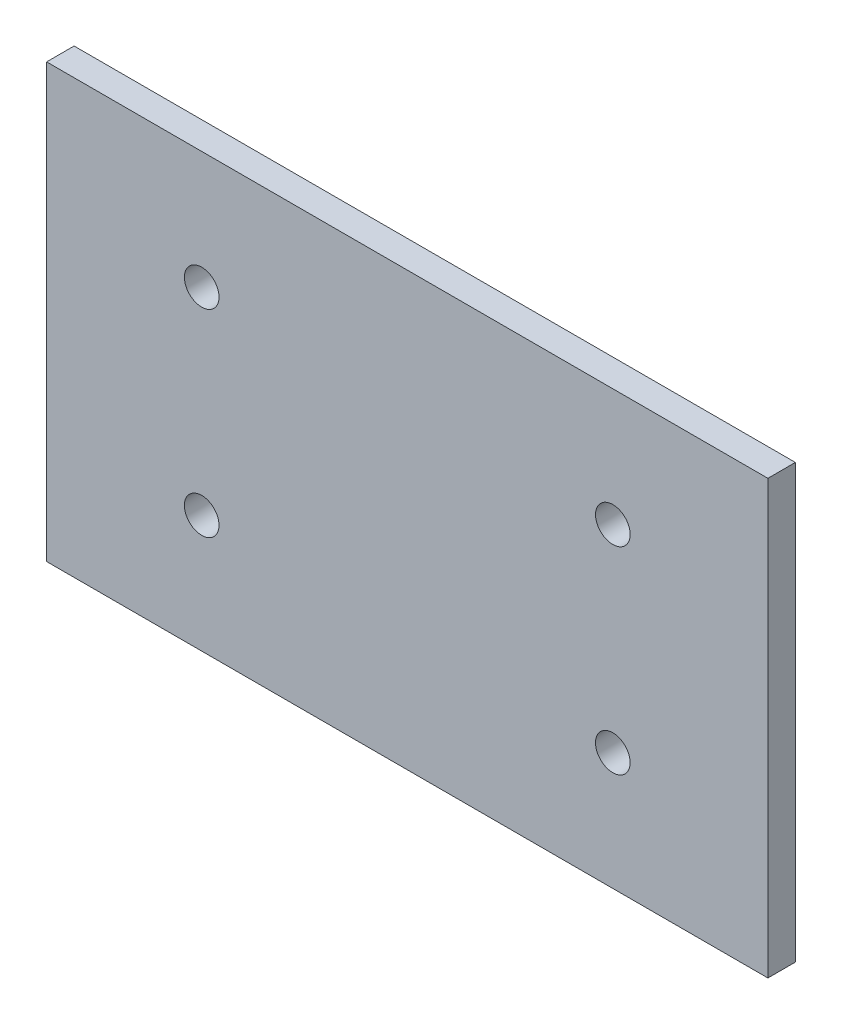
ISO-10303-21;
HEADER;
FILE_DESCRIPTION(('STEP AP214'),'2;1');
FILE_NAME('part.step','',(''),(''),'','','');
FILE_SCHEMA(('AUTOMOTIVE_DESIGN { 1 0 10303 214 1 1 1 1 }'));
ENDSEC;
DATA;
#1=APPLICATION_CONTEXT('core data for automotive mechanical design processes');
#2=APPLICATION_PROTOCOL_DEFINITION('international standard','automotive_design',2000,#1);
#3=PRODUCT_CONTEXT('',#1,'mechanical');
#4=PRODUCT('Part','Part','',(#3));
#5=PRODUCT_RELATED_PRODUCT_CATEGORY('part','',(#4));
#6=PRODUCT_DEFINITION_FORMATION('','',#4);
#7=PRODUCT_DEFINITION_CONTEXT('part definition',#1,'design');
#8=PRODUCT_DEFINITION('design','',#6,#7);
#9=PRODUCT_DEFINITION_SHAPE('','',#8);
#10=(LENGTH_UNIT() NAMED_UNIT(*) SI_UNIT(.MILLI.,.METRE.));
#11=(NAMED_UNIT(*) PLANE_ANGLE_UNIT() SI_UNIT($,.RADIAN.));
#12=(NAMED_UNIT(*) SI_UNIT($,.STERADIAN.) SOLID_ANGLE_UNIT());
#13=UNCERTAINTY_MEASURE_WITH_UNIT(LENGTH_MEASURE(1.E-05),#10,'distance_accuracy_value','');
#14=(GEOMETRIC_REPRESENTATION_CONTEXT(3) GLOBAL_UNCERTAINTY_ASSIGNED_CONTEXT((#13)) GLOBAL_UNIT_ASSIGNED_CONTEXT((#10,
#11,#12)) REPRESENTATION_CONTEXT('',''));
#15=CARTESIAN_POINT('',(0.,0.,0.));
#16=DIRECTION('',(0.,0.,1.));
#17=DIRECTION('',(1.,0.,0.));
#18=AXIS2_PLACEMENT_3D('',#15,#16,#17);
#19=CARTESIAN_POINT('',(0.,0.,9.525));
#20=DIRECTION('',(0.,0.,1.));
#21=DIRECTION('',(1.,0.,0.));
#22=AXIS2_PLACEMENT_3D('',#19,#20,#21);
#23=PLANE('',#22);
#24=CARTESIAN_POINT('',(196.25,-109.25,9.525));
#25=DIRECTION('',(0.,0.,1.));
#26=DIRECTION('',(1.,0.,0.));
#27=AXIS2_PLACEMENT_3D('',#24,#25,#26);
#28=CIRCLE('',#27,6.00000000000002);
#29=CARTESIAN_POINT('',(190.25,-109.25,9.525));
#30=VERTEX_POINT('',#29);
#31=EDGE_CURVE('E121',#30,#30,#28,.T.);
#32=ORIENTED_EDGE('',*,*,#31,.F.);
#33=EDGE_LOOP('',(#32));
#34=FACE_BOUND('',#33,.T.);
#35=CARTESIAN_POINT('',(53.75,-40.75,9.525));
#36=DIRECTION('',(0.,0.,1.));
#37=DIRECTION('',(1.,0.,0.));
#38=AXIS2_PLACEMENT_3D('',#35,#36,#37);
#39=CIRCLE('',#38,6.00000000000001);
#40=CARTESIAN_POINT('',(47.75,-40.75,9.525));
#41=VERTEX_POINT('',#40);
#42=EDGE_CURVE('E100',#41,#41,#39,.T.);
#43=ORIENTED_EDGE('',*,*,#42,.F.);
#44=EDGE_LOOP('',(#43));
#45=FACE_BOUND('',#44,.T.);
#46=DIRECTION('',(0.,-1.,0.));
#47=VECTOR('',#46,1.);
#48=CARTESIAN_POINT('',(0.,0.,9.525));
#49=LINE('',#48,#47);
#50=CARTESIAN_POINT('',(0.,0.,9.525));
#51=VERTEX_POINT('',#50);
#52=CARTESIAN_POINT('',(0.,-150.,9.525));
#53=VERTEX_POINT('',#52);
#54=EDGE_CURVE('E85',#51,#53,#49,.T.);
#55=ORIENTED_EDGE('',*,*,#54,.T.);
#56=DIRECTION('',(1.,0.,0.));
#57=VECTOR('',#56,1.);
#58=CARTESIAN_POINT('',(0.,-150.,9.525));
#59=LINE('',#58,#57);
#60=CARTESIAN_POINT('',(250.,-150.,9.525));
#61=VERTEX_POINT('',#60);
#62=EDGE_CURVE('E80',#53,#61,#59,.T.);
#63=ORIENTED_EDGE('',*,*,#62,.T.);
#64=DIRECTION('',(0.,1.,0.));
#65=VECTOR('',#64,1.);
#66=CARTESIAN_POINT('',(250.,0.,9.525));
#67=LINE('',#66,#65);
#68=CARTESIAN_POINT('',(250.,0.,9.525));
#69=VERTEX_POINT('',#68);
#70=EDGE_CURVE('E83',#61,#69,#67,.T.);
#71=ORIENTED_EDGE('',*,*,#70,.T.);
#72=DIRECTION('',(-1.,0.,0.));
#73=VECTOR('',#72,1.);
#74=CARTESIAN_POINT('',(0.,0.,9.525));
#75=LINE('',#74,#73);
#76=EDGE_CURVE('E50',#69,#51,#75,.T.);
#77=ORIENTED_EDGE('',*,*,#76,.T.);
#78=EDGE_LOOP('',(#55,#63,#71,#77));
#79=FACE_BOUND('',#78,.T.);
#80=CARTESIAN_POINT('',(196.25,-40.75,9.525));
#81=DIRECTION('',(0.,0.,1.));
#82=DIRECTION('',(1.,0.,0.));
#83=AXIS2_PLACEMENT_3D('',#80,#81,#82);
#84=CIRCLE('',#83,6.00000000000002);
#85=CARTESIAN_POINT('',(190.25,-40.75,9.525));
#86=VERTEX_POINT('',#85);
#87=EDGE_CURVE('E115',#86,#86,#84,.T.);
#88=ORIENTED_EDGE('',*,*,#87,.F.);
#89=EDGE_LOOP('',(#88));
#90=FACE_BOUND('',#89,.T.);
#91=CARTESIAN_POINT('',(53.75,-109.25,9.525));
#92=DIRECTION('',(0.,0.,1.));
#93=DIRECTION('',(1.,0.,0.));
#94=AXIS2_PLACEMENT_3D('',#91,#92,#93);
#95=CIRCLE('',#94,6.00000000000001);
#96=CARTESIAN_POINT('',(47.75,-109.25,9.525));
#97=VERTEX_POINT('',#96);
#98=EDGE_CURVE('E127',#97,#97,#95,.T.);
#99=ORIENTED_EDGE('',*,*,#98,.F.);
#100=EDGE_LOOP('',(#99));
#101=FACE_BOUND('',#100,.T.);
#102=ADVANCED_FACE('F33',(#34,#45,#79,#90,#101),#23,.T.);
#103=CARTESIAN_POINT('',(0.,0.,0.));
#104=DIRECTION('',(0.,0.,1.));
#105=DIRECTION('',(1.,0.,0.));
#106=AXIS2_PLACEMENT_3D('',#103,#104,#105);
#107=PLANE('',#106);
#108=DIRECTION('',(0.,-1.,0.));
#109=VECTOR('',#108,1.);
#110=CARTESIAN_POINT('',(0.,0.,0.));
#111=LINE('',#110,#109);
#112=CARTESIAN_POINT('',(0.,0.,0.));
#113=VERTEX_POINT('',#112);
#114=CARTESIAN_POINT('',(0.,-150.,0.));
#115=VERTEX_POINT('',#114);
#116=EDGE_CURVE('E97',#113,#115,#111,.T.);
#117=ORIENTED_EDGE('',*,*,#116,.F.);
#118=DIRECTION('',(-1.,0.,0.));
#119=VECTOR('',#118,1.);
#120=CARTESIAN_POINT('',(0.,0.,0.));
#121=LINE('',#120,#119);
#122=CARTESIAN_POINT('',(250.,0.,0.));
#123=VERTEX_POINT('',#122);
#124=EDGE_CURVE('E73',#123,#113,#121,.T.);
#125=ORIENTED_EDGE('',*,*,#124,.F.);
#126=DIRECTION('',(0.,1.,0.));
#127=VECTOR('',#126,1.);
#128=CARTESIAN_POINT('',(250.,0.,0.));
#129=LINE('',#128,#127);
#130=CARTESIAN_POINT('',(250.,-150.,0.));
#131=VERTEX_POINT('',#130);
#132=EDGE_CURVE('E67',#131,#123,#129,.T.);
#133=ORIENTED_EDGE('',*,*,#132,.F.);
#134=DIRECTION('',(1.,0.,0.));
#135=VECTOR('',#134,1.);
#136=CARTESIAN_POINT('',(0.,-150.,0.));
#137=LINE('',#136,#135);
#138=EDGE_CURVE('E89',#115,#131,#137,.T.);
#139=ORIENTED_EDGE('',*,*,#138,.F.);
#140=EDGE_LOOP('',(#117,#125,#133,#139));
#141=FACE_BOUND('',#140,.T.);
#142=CARTESIAN_POINT('',(53.75,-40.75,0.));
#143=DIRECTION('',(0.,0.,1.));
#144=DIRECTION('',(1.,0.,0.));
#145=AXIS2_PLACEMENT_3D('',#142,#143,#144);
#146=CIRCLE('',#145,6.00000000000001);
#147=CARTESIAN_POINT('',(47.75,-40.75,0.));
#148=VERTEX_POINT('',#147);
#149=EDGE_CURVE('E112',#148,#148,#146,.T.);
#150=ORIENTED_EDGE('',*,*,#149,.T.);
#151=EDGE_LOOP('',(#150));
#152=FACE_BOUND('',#151,.T.);
#153=CARTESIAN_POINT('',(196.25,-40.75,0.));
#154=DIRECTION('',(0.,0.,1.));
#155=DIRECTION('',(1.,0.,0.));
#156=AXIS2_PLACEMENT_3D('',#153,#154,#155);
#157=CIRCLE('',#156,6.00000000000002);
#158=CARTESIAN_POINT('',(190.25,-40.75,0.));
#159=VERTEX_POINT('',#158);
#160=EDGE_CURVE('E118',#159,#159,#157,.T.);
#161=ORIENTED_EDGE('',*,*,#160,.T.);
#162=EDGE_LOOP('',(#161));
#163=FACE_BOUND('',#162,.T.);
#164=CARTESIAN_POINT('',(196.25,-109.25,0.));
#165=DIRECTION('',(0.,0.,1.));
#166=DIRECTION('',(1.,0.,0.));
#167=AXIS2_PLACEMENT_3D('',#164,#165,#166);
#168=CIRCLE('',#167,6.00000000000002);
#169=CARTESIAN_POINT('',(190.25,-109.25,0.));
#170=VERTEX_POINT('',#169);
#171=EDGE_CURVE('E124',#170,#170,#168,.T.);
#172=ORIENTED_EDGE('',*,*,#171,.T.);
#173=EDGE_LOOP('',(#172));
#174=FACE_BOUND('',#173,.T.);
#175=CARTESIAN_POINT('',(53.75,-109.25,0.));
#176=DIRECTION('',(0.,0.,1.));
#177=DIRECTION('',(1.,0.,0.));
#178=AXIS2_PLACEMENT_3D('',#175,#176,#177);
#179=CIRCLE('',#178,6.00000000000001);
#180=CARTESIAN_POINT('',(47.75,-109.25,0.));
#181=VERTEX_POINT('',#180);
#182=EDGE_CURVE('E130',#181,#181,#179,.T.);
#183=ORIENTED_EDGE('',*,*,#182,.T.);
#184=EDGE_LOOP('',(#183));
#185=FACE_BOUND('',#184,.T.);
#186=ADVANCED_FACE('F108',(#141,#152,#163,#174,#185),#107,.F.);
#187=CARTESIAN_POINT('',(0.,0.,9.525));
#188=DIRECTION('',(1.,0.,0.));
#189=DIRECTION('',(0.,1.,0.));
#190=AXIS2_PLACEMENT_3D('',#187,#188,#189);
#191=PLANE('',#190);
#192=ORIENTED_EDGE('',*,*,#116,.T.);
#193=DIRECTION('',(0.,0.,-1.));
#194=VECTOR('',#193,1.);
#195=CARTESIAN_POINT('',(0.,-150.,9.525));
#196=LINE('',#195,#194);
#197=EDGE_CURVE('E11',#53,#115,#196,.T.);
#198=ORIENTED_EDGE('',*,*,#197,.F.);
#199=ORIENTED_EDGE('',*,*,#54,.F.);
#200=DIRECTION('',(0.,0.,-1.));
#201=VECTOR('',#200,1.);
#202=CARTESIAN_POINT('',(0.,0.,9.525));
#203=LINE('',#202,#201);
#204=EDGE_CURVE('E93',#51,#113,#203,.T.);
#205=ORIENTED_EDGE('',*,*,#204,.T.);
#206=EDGE_LOOP('',(#192,#198,#199,#205));
#207=FACE_BOUND('',#206,.T.);
#208=ADVANCED_FACE('F35',(#207),#191,.F.);
#209=CARTESIAN_POINT('',(0.,-150.,9.525));
#210=DIRECTION('',(0.,1.,0.));
#211=DIRECTION('',(0.,0.,1.));
#212=AXIS2_PLACEMENT_3D('',#209,#210,#211);
#213=PLANE('',#212);
#214=ORIENTED_EDGE('',*,*,#138,.T.);
#215=DIRECTION('',(0.,0.,-1.));
#216=VECTOR('',#215,1.);
#217=CARTESIAN_POINT('',(250.,-150.,9.525));
#218=LINE('',#217,#216);
#219=EDGE_CURVE('E42',#61,#131,#218,.T.);
#220=ORIENTED_EDGE('',*,*,#219,.F.);
#221=ORIENTED_EDGE('',*,*,#62,.F.);
#222=ORIENTED_EDGE('',*,*,#197,.T.);
#223=EDGE_LOOP('',(#214,#220,#221,#222));
#224=FACE_BOUND('',#223,.T.);
#225=ADVANCED_FACE('F88',(#224),#213,.F.);
#226=CARTESIAN_POINT('',(250.,0.,9.525));
#227=DIRECTION('',(-1.,0.,0.));
#228=DIRECTION('',(0.,-1.,0.));
#229=AXIS2_PLACEMENT_3D('',#226,#227,#228);
#230=PLANE('',#229);
#231=ORIENTED_EDGE('',*,*,#132,.T.);
#232=DIRECTION('',(0.,0.,-1.));
#233=VECTOR('',#232,1.);
#234=CARTESIAN_POINT('',(250.,0.,9.525));
#235=LINE('',#234,#233);
#236=EDGE_CURVE('E90',#69,#123,#235,.T.);
#237=ORIENTED_EDGE('',*,*,#236,.F.);
#238=ORIENTED_EDGE('',*,*,#70,.F.);
#239=ORIENTED_EDGE('',*,*,#219,.T.);
#240=EDGE_LOOP('',(#231,#237,#238,#239));
#241=FACE_BOUND('',#240,.T.);
#242=ADVANCED_FACE('F91',(#241),#230,.F.);
#243=CARTESIAN_POINT('',(0.,0.,9.525));
#244=DIRECTION('',(0.,-1.,0.));
#245=DIRECTION('',(0.,0.,-1.));
#246=AXIS2_PLACEMENT_3D('',#243,#244,#245);
#247=PLANE('',#246);
#248=ORIENTED_EDGE('',*,*,#124,.T.);
#249=ORIENTED_EDGE('',*,*,#204,.F.);
#250=ORIENTED_EDGE('',*,*,#76,.F.);
#251=ORIENTED_EDGE('',*,*,#236,.T.);
#252=EDGE_LOOP('',(#248,#249,#250,#251));
#253=FACE_BOUND('',#252,.T.);
#254=ADVANCED_FACE('F105',(#253),#247,.F.);
#255=CARTESIAN_POINT('',(53.75,-40.75,9.525));
#256=DIRECTION('',(0.,0.,-1.));
#257=DIRECTION('',(-1.,0.,0.));
#258=AXIS2_PLACEMENT_3D('',#255,#256,#257);
#259=CYLINDRICAL_SURFACE('',#258,6.00000000000001);
#260=CARTESIAN_POINT('',(47.75,-40.75,9.525));
#261=CARTESIAN_POINT('',(47.75,-40.75,9.42578125));
#262=CARTESIAN_POINT('',(47.75,-40.75,9.3265625));
#263=CARTESIAN_POINT('',(47.75,-40.75,9.128125));
#264=CARTESIAN_POINT('',(47.75,-40.75,9.02890625));
#265=CARTESIAN_POINT('',(47.75,-40.75,8.83046875));
#266=CARTESIAN_POINT('',(47.75,-40.75,8.73125));
#267=CARTESIAN_POINT('',(47.75,-40.75,8.5328125));
#268=CARTESIAN_POINT('',(47.75,-40.75,8.43359375));
#269=CARTESIAN_POINT('',(47.75,-40.75,8.23515625));
#270=CARTESIAN_POINT('',(47.75,-40.75,8.1359375));
#271=CARTESIAN_POINT('',(47.75,-40.75,7.9375));
#272=CARTESIAN_POINT('',(47.75,-40.75,7.83828125));
#273=CARTESIAN_POINT('',(47.75,-40.75,7.63984375));
#274=CARTESIAN_POINT('',(47.75,-40.75,7.540625));
#275=CARTESIAN_POINT('',(47.75,-40.75,7.3421875));
#276=CARTESIAN_POINT('',(47.75,-40.75,7.24296875));
#277=CARTESIAN_POINT('',(47.75,-40.75,7.04453125));
#278=CARTESIAN_POINT('',(47.75,-40.75,6.9453125));
#279=CARTESIAN_POINT('',(47.75,-40.75,6.746875));
#280=CARTESIAN_POINT('',(47.75,-40.75,6.64765625));
#281=CARTESIAN_POINT('',(47.75,-40.75,6.44921875));
#282=CARTESIAN_POINT('',(47.75,-40.75,6.35));
#283=CARTESIAN_POINT('',(47.75,-40.75,6.1515625));
#284=CARTESIAN_POINT('',(47.75,-40.75,6.05234375));
#285=CARTESIAN_POINT('',(47.75,-40.75,5.85390625));
#286=CARTESIAN_POINT('',(47.75,-40.75,5.7546875));
#287=CARTESIAN_POINT('',(47.75,-40.75,5.55625));
#288=CARTESIAN_POINT('',(47.75,-40.75,5.45703125));
#289=CARTESIAN_POINT('',(47.75,-40.75,5.25859375));
#290=CARTESIAN_POINT('',(47.75,-40.75,5.159375));
#291=CARTESIAN_POINT('',(47.75,-40.75,4.9609375));
#292=CARTESIAN_POINT('',(47.75,-40.75,4.86171875));
#293=CARTESIAN_POINT('',(47.75,-40.75,4.66328125));
#294=CARTESIAN_POINT('',(47.75,-40.75,4.5640625));
#295=CARTESIAN_POINT('',(47.75,-40.75,4.365625));
#296=CARTESIAN_POINT('',(47.75,-40.75,4.26640625));
#297=CARTESIAN_POINT('',(47.75,-40.75,4.06796875));
#298=CARTESIAN_POINT('',(47.75,-40.75,3.96875));
#299=CARTESIAN_POINT('',(47.75,-40.75,3.7703125));
#300=CARTESIAN_POINT('',(47.75,-40.75,3.67109375));
#301=CARTESIAN_POINT('',(47.75,-40.75,3.47265625));
#302=CARTESIAN_POINT('',(47.75,-40.75,3.3734375));
#303=CARTESIAN_POINT('',(47.75,-40.75,3.175));
#304=CARTESIAN_POINT('',(47.75,-40.75,3.07578125));
#305=CARTESIAN_POINT('',(47.75,-40.75,2.87734375));
#306=CARTESIAN_POINT('',(47.75,-40.75,2.778125));
#307=CARTESIAN_POINT('',(47.75,-40.75,2.5796875));
#308=CARTESIAN_POINT('',(47.75,-40.75,2.48046875));
#309=CARTESIAN_POINT('',(47.75,-40.75,2.28203125));
#310=CARTESIAN_POINT('',(47.75,-40.75,2.1828125));
#311=CARTESIAN_POINT('',(47.75,-40.75,1.984375));
#312=CARTESIAN_POINT('',(47.75,-40.75,1.88515625));
#313=CARTESIAN_POINT('',(47.75,-40.75,1.68671875));
#314=CARTESIAN_POINT('',(47.75,-40.75,1.5875));
#315=CARTESIAN_POINT('',(47.75,-40.75,1.3890625));
#316=CARTESIAN_POINT('',(47.75,-40.75,1.28984375));
#317=CARTESIAN_POINT('',(47.75,-40.75,1.09140625));
#318=CARTESIAN_POINT('',(47.75,-40.75,0.992187500000001));
#319=CARTESIAN_POINT('',(47.75,-40.75,0.793750000000001));
#320=CARTESIAN_POINT('',(47.75,-40.75,0.69453125));
#321=CARTESIAN_POINT('',(47.75,-40.75,0.49609375));
#322=CARTESIAN_POINT('',(47.75,-40.75,0.396875));
#323=CARTESIAN_POINT('',(47.75,-40.75,0.1984375));
#324=CARTESIAN_POINT('',(47.75,-40.75,0.0992187500000001));
#325=CARTESIAN_POINT('',(47.75,-40.75,0.));
#326=B_SPLINE_CURVE_WITH_KNOTS('',3,(#260,#261,#262,#263,#264,#265,#266,#267,#268,#269,#270,
#271,#272,#273,#274,#275,#276,#277,#278,#279,#280,#281,#282,#283,#284,#285,#286,#287,#288,#289,
#290,#291,#292,#293,#294,#295,#296,#297,#298,#299,#300,#301,#302,#303,#304,#305,#306,#307,#308,
#309,#310,#311,#312,#313,#314,#315,#316,#317,#318,#319,#320,#321,#322,#323,#324,#325),
.UNSPECIFIED.,.F.,.F.,(4,2,2,2,2,2,2,2,2,2,2,2,2,2,2,2,2,2,2,2,2,2,2,2,2,2,2,2,2,2,2,2,4),(0.,
0.29765625,0.5953125,0.892968750000001,1.190625,1.48828125,1.7859375,2.08359375,2.38125,
2.67890625,2.9765625,3.27421875,3.571875,3.86953125,4.1671875,4.46484375,4.7625,5.06015625,
5.3578125,5.65546875,5.953125,6.25078125,6.5484375,6.84609375,7.14375,7.44140625,7.7390625,
8.03671875,8.334375,8.63203125,8.9296875,9.22734375,9.525),.UNSPECIFIED.);
#327=EDGE_CURVE('BSEAM149',#41,#148,#326,.T.);
#328=ORIENTED_EDGE('',*,*,#42,.T.);
#329=ORIENTED_EDGE('',*,*,#149,.F.);
#330=ORIENTED_EDGE('',*,*,#327,.T.);
#331=ORIENTED_EDGE('',*,*,#327,.F.);
#332=EDGE_LOOP('',(#328,#330,#329,#331));
#333=FACE_BOUND('',#332,.T.);
#334=ADVANCED_FACE('F149',(#333),#259,.F.);
#335=CARTESIAN_POINT('',(196.25,-40.75,9.525));
#336=DIRECTION('',(0.,0.,-1.));
#337=DIRECTION('',(-1.,0.,0.));
#338=AXIS2_PLACEMENT_3D('',#335,#336,#337);
#339=CYLINDRICAL_SURFACE('',#338,6.00000000000002);
#340=CARTESIAN_POINT('',(190.25,-40.75,9.525));
#341=CARTESIAN_POINT('',(190.25,-40.75,9.42578125));
#342=CARTESIAN_POINT('',(190.25,-40.75,9.3265625));
#343=CARTESIAN_POINT('',(190.25,-40.75,9.128125));
#344=CARTESIAN_POINT('',(190.25,-40.75,9.02890625));
#345=CARTESIAN_POINT('',(190.25,-40.75,8.83046875));
#346=CARTESIAN_POINT('',(190.25,-40.75,8.73125));
#347=CARTESIAN_POINT('',(190.25,-40.75,8.5328125));
#348=CARTESIAN_POINT('',(190.25,-40.75,8.43359375));
#349=CARTESIAN_POINT('',(190.25,-40.75,8.23515625));
#350=CARTESIAN_POINT('',(190.25,-40.75,8.1359375));
#351=CARTESIAN_POINT('',(190.25,-40.75,7.9375));
#352=CARTESIAN_POINT('',(190.25,-40.75,7.83828125));
#353=CARTESIAN_POINT('',(190.25,-40.75,7.63984375));
#354=CARTESIAN_POINT('',(190.25,-40.75,7.540625));
#355=CARTESIAN_POINT('',(190.25,-40.75,7.3421875));
#356=CARTESIAN_POINT('',(190.25,-40.75,7.24296875));
#357=CARTESIAN_POINT('',(190.25,-40.75,7.04453125));
#358=CARTESIAN_POINT('',(190.25,-40.75,6.9453125));
#359=CARTESIAN_POINT('',(190.25,-40.75,6.746875));
#360=CARTESIAN_POINT('',(190.25,-40.75,6.64765625));
#361=CARTESIAN_POINT('',(190.25,-40.75,6.44921875));
#362=CARTESIAN_POINT('',(190.25,-40.75,6.35));
#363=CARTESIAN_POINT('',(190.25,-40.75,6.1515625));
#364=CARTESIAN_POINT('',(190.25,-40.75,6.05234375));
#365=CARTESIAN_POINT('',(190.25,-40.75,5.85390625));
#366=CARTESIAN_POINT('',(190.25,-40.75,5.7546875));
#367=CARTESIAN_POINT('',(190.25,-40.75,5.55625));
#368=CARTESIAN_POINT('',(190.25,-40.75,5.45703125));
#369=CARTESIAN_POINT('',(190.25,-40.75,5.25859375));
#370=CARTESIAN_POINT('',(190.25,-40.75,5.159375));
#371=CARTESIAN_POINT('',(190.25,-40.75,4.9609375));
#372=CARTESIAN_POINT('',(190.25,-40.75,4.86171875));
#373=CARTESIAN_POINT('',(190.25,-40.75,4.66328125));
#374=CARTESIAN_POINT('',(190.25,-40.75,4.5640625));
#375=CARTESIAN_POINT('',(190.25,-40.75,4.365625));
#376=CARTESIAN_POINT('',(190.25,-40.75,4.26640625));
#377=CARTESIAN_POINT('',(190.25,-40.75,4.06796875));
#378=CARTESIAN_POINT('',(190.25,-40.75,3.96875));
#379=CARTESIAN_POINT('',(190.25,-40.75,3.7703125));
#380=CARTESIAN_POINT('',(190.25,-40.75,3.67109375));
#381=CARTESIAN_POINT('',(190.25,-40.75,3.47265625));
#382=CARTESIAN_POINT('',(190.25,-40.75,3.3734375));
#383=CARTESIAN_POINT('',(190.25,-40.75,3.175));
#384=CARTESIAN_POINT('',(190.25,-40.75,3.07578125));
#385=CARTESIAN_POINT('',(190.25,-40.75,2.87734375));
#386=CARTESIAN_POINT('',(190.25,-40.75,2.778125));
#387=CARTESIAN_POINT('',(190.25,-40.75,2.5796875));
#388=CARTESIAN_POINT('',(190.25,-40.75,2.48046875));
#389=CARTESIAN_POINT('',(190.25,-40.75,2.28203125));
#390=CARTESIAN_POINT('',(190.25,-40.75,2.1828125));
#391=CARTESIAN_POINT('',(190.25,-40.75,1.984375));
#392=CARTESIAN_POINT('',(190.25,-40.75,1.88515625));
#393=CARTESIAN_POINT('',(190.25,-40.75,1.68671875));
#394=CARTESIAN_POINT('',(190.25,-40.75,1.5875));
#395=CARTESIAN_POINT('',(190.25,-40.75,1.3890625));
#396=CARTESIAN_POINT('',(190.25,-40.75,1.28984375));
#397=CARTESIAN_POINT('',(190.25,-40.75,1.09140625));
#398=CARTESIAN_POINT('',(190.25,-40.75,0.992187500000001));
#399=CARTESIAN_POINT('',(190.25,-40.75,0.793750000000001));
#400=CARTESIAN_POINT('',(190.25,-40.75,0.69453125));
#401=CARTESIAN_POINT('',(190.25,-40.75,0.49609375));
#402=CARTESIAN_POINT('',(190.25,-40.75,0.396875));
#403=CARTESIAN_POINT('',(190.25,-40.75,0.1984375));
#404=CARTESIAN_POINT('',(190.25,-40.75,0.0992187500000001));
#405=CARTESIAN_POINT('',(190.25,-40.75,0.));
#406=B_SPLINE_CURVE_WITH_KNOTS('',3,(#340,#341,#342,#343,#344,#345,#346,#347,#348,#349,#350,
#351,#352,#353,#354,#355,#356,#357,#358,#359,#360,#361,#362,#363,#364,#365,#366,#367,#368,#369,
#370,#371,#372,#373,#374,#375,#376,#377,#378,#379,#380,#381,#382,#383,#384,#385,#386,#387,#388,
#389,#390,#391,#392,#393,#394,#395,#396,#397,#398,#399,#400,#401,#402,#403,#404,#405),
.UNSPECIFIED.,.F.,.F.,(4,2,2,2,2,2,2,2,2,2,2,2,2,2,2,2,2,2,2,2,2,2,2,2,2,2,2,2,2,2,2,2,4),(0.,
0.29765625,0.5953125,0.892968750000001,1.190625,1.48828125,1.7859375,2.08359375,2.38125,
2.67890625,2.9765625,3.27421875,3.571875,3.86953125,4.1671875,4.46484375,4.7625,5.06015625,
5.3578125,5.65546875,5.953125,6.25078125,6.5484375,6.84609375,7.14375,7.44140625,7.7390625,
8.03671875,8.334375,8.63203125,8.9296875,9.22734375,9.525),.UNSPECIFIED.);
#407=EDGE_CURVE('BSEAM195',#86,#159,#406,.T.);
#408=ORIENTED_EDGE('',*,*,#87,.T.);
#409=ORIENTED_EDGE('',*,*,#160,.F.);
#410=ORIENTED_EDGE('',*,*,#407,.T.);
#411=ORIENTED_EDGE('',*,*,#407,.F.);
#412=EDGE_LOOP('',(#408,#410,#409,#411));
#413=FACE_BOUND('',#412,.T.);
#414=ADVANCED_FACE('F195',(#413),#339,.F.);
#415=CARTESIAN_POINT('',(196.25,-109.25,9.525));
#416=DIRECTION('',(0.,0.,-1.));
#417=DIRECTION('',(-1.,0.,0.));
#418=AXIS2_PLACEMENT_3D('',#415,#416,#417);
#419=CYLINDRICAL_SURFACE('',#418,6.00000000000002);
#420=CARTESIAN_POINT('',(190.25,-109.25,9.525));
#421=CARTESIAN_POINT('',(190.25,-109.25,9.42578125));
#422=CARTESIAN_POINT('',(190.25,-109.25,9.3265625));
#423=CARTESIAN_POINT('',(190.25,-109.25,9.128125));
#424=CARTESIAN_POINT('',(190.25,-109.25,9.02890625));
#425=CARTESIAN_POINT('',(190.25,-109.25,8.83046875));
#426=CARTESIAN_POINT('',(190.25,-109.25,8.73125));
#427=CARTESIAN_POINT('',(190.25,-109.25,8.5328125));
#428=CARTESIAN_POINT('',(190.25,-109.25,8.43359375));
#429=CARTESIAN_POINT('',(190.25,-109.25,8.23515625));
#430=CARTESIAN_POINT('',(190.25,-109.25,8.1359375));
#431=CARTESIAN_POINT('',(190.25,-109.25,7.9375));
#432=CARTESIAN_POINT('',(190.25,-109.25,7.83828125));
#433=CARTESIAN_POINT('',(190.25,-109.25,7.63984375));
#434=CARTESIAN_POINT('',(190.25,-109.25,7.540625));
#435=CARTESIAN_POINT('',(190.25,-109.25,7.3421875));
#436=CARTESIAN_POINT('',(190.25,-109.25,7.24296875));
#437=CARTESIAN_POINT('',(190.25,-109.25,7.04453125));
#438=CARTESIAN_POINT('',(190.25,-109.25,6.9453125));
#439=CARTESIAN_POINT('',(190.25,-109.25,6.746875));
#440=CARTESIAN_POINT('',(190.25,-109.25,6.64765625));
#441=CARTESIAN_POINT('',(190.25,-109.25,6.44921875));
#442=CARTESIAN_POINT('',(190.25,-109.25,6.35));
#443=CARTESIAN_POINT('',(190.25,-109.25,6.1515625));
#444=CARTESIAN_POINT('',(190.25,-109.25,6.05234375));
#445=CARTESIAN_POINT('',(190.25,-109.25,5.85390625));
#446=CARTESIAN_POINT('',(190.25,-109.25,5.7546875));
#447=CARTESIAN_POINT('',(190.25,-109.25,5.55625));
#448=CARTESIAN_POINT('',(190.25,-109.25,5.45703125));
#449=CARTESIAN_POINT('',(190.25,-109.25,5.25859375));
#450=CARTESIAN_POINT('',(190.25,-109.25,5.159375));
#451=CARTESIAN_POINT('',(190.25,-109.25,4.9609375));
#452=CARTESIAN_POINT('',(190.25,-109.25,4.86171875));
#453=CARTESIAN_POINT('',(190.25,-109.25,4.66328125));
#454=CARTESIAN_POINT('',(190.25,-109.25,4.5640625));
#455=CARTESIAN_POINT('',(190.25,-109.25,4.365625));
#456=CARTESIAN_POINT('',(190.25,-109.25,4.26640625));
#457=CARTESIAN_POINT('',(190.25,-109.25,4.06796875));
#458=CARTESIAN_POINT('',(190.25,-109.25,3.96875));
#459=CARTESIAN_POINT('',(190.25,-109.25,3.7703125));
#460=CARTESIAN_POINT('',(190.25,-109.25,3.67109375));
#461=CARTESIAN_POINT('',(190.25,-109.25,3.47265625));
#462=CARTESIAN_POINT('',(190.25,-109.25,3.3734375));
#463=CARTESIAN_POINT('',(190.25,-109.25,3.175));
#464=CARTESIAN_POINT('',(190.25,-109.25,3.07578125));
#465=CARTESIAN_POINT('',(190.25,-109.25,2.87734375));
#466=CARTESIAN_POINT('',(190.25,-109.25,2.778125));
#467=CARTESIAN_POINT('',(190.25,-109.25,2.5796875));
#468=CARTESIAN_POINT('',(190.25,-109.25,2.48046875));
#469=CARTESIAN_POINT('',(190.25,-109.25,2.28203125));
#470=CARTESIAN_POINT('',(190.25,-109.25,2.1828125));
#471=CARTESIAN_POINT('',(190.25,-109.25,1.984375));
#472=CARTESIAN_POINT('',(190.25,-109.25,1.88515625));
#473=CARTESIAN_POINT('',(190.25,-109.25,1.68671875));
#474=CARTESIAN_POINT('',(190.25,-109.25,1.5875));
#475=CARTESIAN_POINT('',(190.25,-109.25,1.3890625));
#476=CARTESIAN_POINT('',(190.25,-109.25,1.28984375));
#477=CARTESIAN_POINT('',(190.25,-109.25,1.09140625));
#478=CARTESIAN_POINT('',(190.25,-109.25,0.992187500000001));
#479=CARTESIAN_POINT('',(190.25,-109.25,0.793750000000001));
#480=CARTESIAN_POINT('',(190.25,-109.25,0.69453125));
#481=CARTESIAN_POINT('',(190.25,-109.25,0.49609375));
#482=CARTESIAN_POINT('',(190.25,-109.25,0.396875));
#483=CARTESIAN_POINT('',(190.25,-109.25,0.1984375));
#484=CARTESIAN_POINT('',(190.25,-109.25,0.0992187500000001));
#485=CARTESIAN_POINT('',(190.25,-109.25,0.));
#486=B_SPLINE_CURVE_WITH_KNOTS('',3,(#420,#421,#422,#423,#424,#425,#426,#427,#428,#429,#430,
#431,#432,#433,#434,#435,#436,#437,#438,#439,#440,#441,#442,#443,#444,#445,#446,#447,#448,#449,
#450,#451,#452,#453,#454,#455,#456,#457,#458,#459,#460,#461,#462,#463,#464,#465,#466,#467,#468,
#469,#470,#471,#472,#473,#474,#475,#476,#477,#478,#479,#480,#481,#482,#483,#484,#485),
.UNSPECIFIED.,.F.,.F.,(4,2,2,2,2,2,2,2,2,2,2,2,2,2,2,2,2,2,2,2,2,2,2,2,2,2,2,2,2,2,2,2,4),(0.,
0.29765625,0.5953125,0.892968750000001,1.190625,1.48828125,1.7859375,2.08359375,2.38125,
2.67890625,2.9765625,3.27421875,3.571875,3.86953125,4.1671875,4.46484375,4.7625,5.06015625,
5.3578125,5.65546875,5.953125,6.25078125,6.5484375,6.84609375,7.14375,7.44140625,7.7390625,
8.03671875,8.334375,8.63203125,8.9296875,9.22734375,9.525),.UNSPECIFIED.);
#487=EDGE_CURVE('BSEAM203',#30,#170,#486,.T.);
#488=ORIENTED_EDGE('',*,*,#31,.T.);
#489=ORIENTED_EDGE('',*,*,#171,.F.);
#490=ORIENTED_EDGE('',*,*,#487,.T.);
#491=ORIENTED_EDGE('',*,*,#487,.F.);
#492=EDGE_LOOP('',(#488,#490,#489,#491));
#493=FACE_BOUND('',#492,.T.);
#494=ADVANCED_FACE('F203',(#493),#419,.F.);
#495=CARTESIAN_POINT('',(53.75,-109.25,9.525));
#496=DIRECTION('',(0.,0.,-1.));
#497=DIRECTION('',(-1.,0.,0.));
#498=AXIS2_PLACEMENT_3D('',#495,#496,#497);
#499=CYLINDRICAL_SURFACE('',#498,6.00000000000001);
#500=CARTESIAN_POINT('',(47.75,-109.25,9.525));
#501=CARTESIAN_POINT('',(47.75,-109.25,9.42578125));
#502=CARTESIAN_POINT('',(47.75,-109.25,9.3265625));
#503=CARTESIAN_POINT('',(47.75,-109.25,9.128125));
#504=CARTESIAN_POINT('',(47.75,-109.25,9.02890625));
#505=CARTESIAN_POINT('',(47.75,-109.25,8.83046875));
#506=CARTESIAN_POINT('',(47.75,-109.25,8.73125));
#507=CARTESIAN_POINT('',(47.75,-109.25,8.5328125));
#508=CARTESIAN_POINT('',(47.75,-109.25,8.43359375));
#509=CARTESIAN_POINT('',(47.75,-109.25,8.23515625));
#510=CARTESIAN_POINT('',(47.75,-109.25,8.1359375));
#511=CARTESIAN_POINT('',(47.75,-109.25,7.9375));
#512=CARTESIAN_POINT('',(47.75,-109.25,7.83828125));
#513=CARTESIAN_POINT('',(47.75,-109.25,7.63984375));
#514=CARTESIAN_POINT('',(47.75,-109.25,7.540625));
#515=CARTESIAN_POINT('',(47.75,-109.25,7.3421875));
#516=CARTESIAN_POINT('',(47.75,-109.25,7.24296875));
#517=CARTESIAN_POINT('',(47.75,-109.25,7.04453125));
#518=CARTESIAN_POINT('',(47.75,-109.25,6.9453125));
#519=CARTESIAN_POINT('',(47.75,-109.25,6.746875));
#520=CARTESIAN_POINT('',(47.75,-109.25,6.64765625));
#521=CARTESIAN_POINT('',(47.75,-109.25,6.44921875));
#522=CARTESIAN_POINT('',(47.75,-109.25,6.35));
#523=CARTESIAN_POINT('',(47.75,-109.25,6.1515625));
#524=CARTESIAN_POINT('',(47.75,-109.25,6.05234375));
#525=CARTESIAN_POINT('',(47.75,-109.25,5.85390625));
#526=CARTESIAN_POINT('',(47.75,-109.25,5.7546875));
#527=CARTESIAN_POINT('',(47.75,-109.25,5.55625));
#528=CARTESIAN_POINT('',(47.75,-109.25,5.45703125));
#529=CARTESIAN_POINT('',(47.75,-109.25,5.25859375));
#530=CARTESIAN_POINT('',(47.75,-109.25,5.159375));
#531=CARTESIAN_POINT('',(47.75,-109.25,4.9609375));
#532=CARTESIAN_POINT('',(47.75,-109.25,4.86171875));
#533=CARTESIAN_POINT('',(47.75,-109.25,4.66328125));
#534=CARTESIAN_POINT('',(47.75,-109.25,4.5640625));
#535=CARTESIAN_POINT('',(47.75,-109.25,4.365625));
#536=CARTESIAN_POINT('',(47.75,-109.25,4.26640625));
#537=CARTESIAN_POINT('',(47.75,-109.25,4.06796875));
#538=CARTESIAN_POINT('',(47.75,-109.25,3.96875));
#539=CARTESIAN_POINT('',(47.75,-109.25,3.7703125));
#540=CARTESIAN_POINT('',(47.75,-109.25,3.67109375));
#541=CARTESIAN_POINT('',(47.75,-109.25,3.47265625));
#542=CARTESIAN_POINT('',(47.75,-109.25,3.3734375));
#543=CARTESIAN_POINT('',(47.75,-109.25,3.175));
#544=CARTESIAN_POINT('',(47.75,-109.25,3.07578125));
#545=CARTESIAN_POINT('',(47.75,-109.25,2.87734375));
#546=CARTESIAN_POINT('',(47.75,-109.25,2.778125));
#547=CARTESIAN_POINT('',(47.75,-109.25,2.5796875));
#548=CARTESIAN_POINT('',(47.75,-109.25,2.48046875));
#549=CARTESIAN_POINT('',(47.75,-109.25,2.28203125));
#550=CARTESIAN_POINT('',(47.75,-109.25,2.1828125));
#551=CARTESIAN_POINT('',(47.75,-109.25,1.984375));
#552=CARTESIAN_POINT('',(47.75,-109.25,1.88515625));
#553=CARTESIAN_POINT('',(47.75,-109.25,1.68671875));
#554=CARTESIAN_POINT('',(47.75,-109.25,1.5875));
#555=CARTESIAN_POINT('',(47.75,-109.25,1.3890625));
#556=CARTESIAN_POINT('',(47.75,-109.25,1.28984375));
#557=CARTESIAN_POINT('',(47.75,-109.25,1.09140625));
#558=CARTESIAN_POINT('',(47.75,-109.25,0.992187500000001));
#559=CARTESIAN_POINT('',(47.75,-109.25,0.793750000000001));
#560=CARTESIAN_POINT('',(47.75,-109.25,0.69453125));
#561=CARTESIAN_POINT('',(47.75,-109.25,0.49609375));
#562=CARTESIAN_POINT('',(47.75,-109.25,0.396875));
#563=CARTESIAN_POINT('',(47.75,-109.25,0.1984375));
#564=CARTESIAN_POINT('',(47.75,-109.25,0.0992187500000001));
#565=CARTESIAN_POINT('',(47.75,-109.25,0.));
#566=B_SPLINE_CURVE_WITH_KNOTS('',3,(#500,#501,#502,#503,#504,#505,#506,#507,#508,#509,#510,
#511,#512,#513,#514,#515,#516,#517,#518,#519,#520,#521,#522,#523,#524,#525,#526,#527,#528,#529,
#530,#531,#532,#533,#534,#535,#536,#537,#538,#539,#540,#541,#542,#543,#544,#545,#546,#547,#548,
#549,#550,#551,#552,#553,#554,#555,#556,#557,#558,#559,#560,#561,#562,#563,#564,#565),
.UNSPECIFIED.,.F.,.F.,(4,2,2,2,2,2,2,2,2,2,2,2,2,2,2,2,2,2,2,2,2,2,2,2,2,2,2,2,2,2,2,2,4),(0.,
0.29765625,0.5953125,0.892968750000001,1.190625,1.48828125,1.7859375,2.08359375,2.38125,
2.67890625,2.9765625,3.27421875,3.571875,3.86953125,4.1671875,4.46484375,4.7625,5.06015625,
5.3578125,5.65546875,5.953125,6.25078125,6.5484375,6.84609375,7.14375,7.44140625,7.7390625,
8.03671875,8.334375,8.63203125,8.9296875,9.22734375,9.525),.UNSPECIFIED.);
#567=EDGE_CURVE('BSEAM136',#97,#181,#566,.T.);
#568=ORIENTED_EDGE('',*,*,#98,.T.);
#569=ORIENTED_EDGE('',*,*,#182,.F.);
#570=ORIENTED_EDGE('',*,*,#567,.T.);
#571=ORIENTED_EDGE('',*,*,#567,.F.);
#572=EDGE_LOOP('',(#568,#570,#569,#571));
#573=FACE_BOUND('',#572,.T.);
#574=ADVANCED_FACE('F136',(#573),#499,.F.);
#575=CLOSED_SHELL('',(#102,#186,#208,#225,#242,#254,#334,#414,#494,#574));
#576=MANIFOLD_SOLID_BREP('B2',#575);
#577=ADVANCED_BREP_SHAPE_REPRESENTATION('',(#18,#576),#14);
#578=SHAPE_DEFINITION_REPRESENTATION(#9,#577);
ENDSEC;
END-ISO-10303-21;
